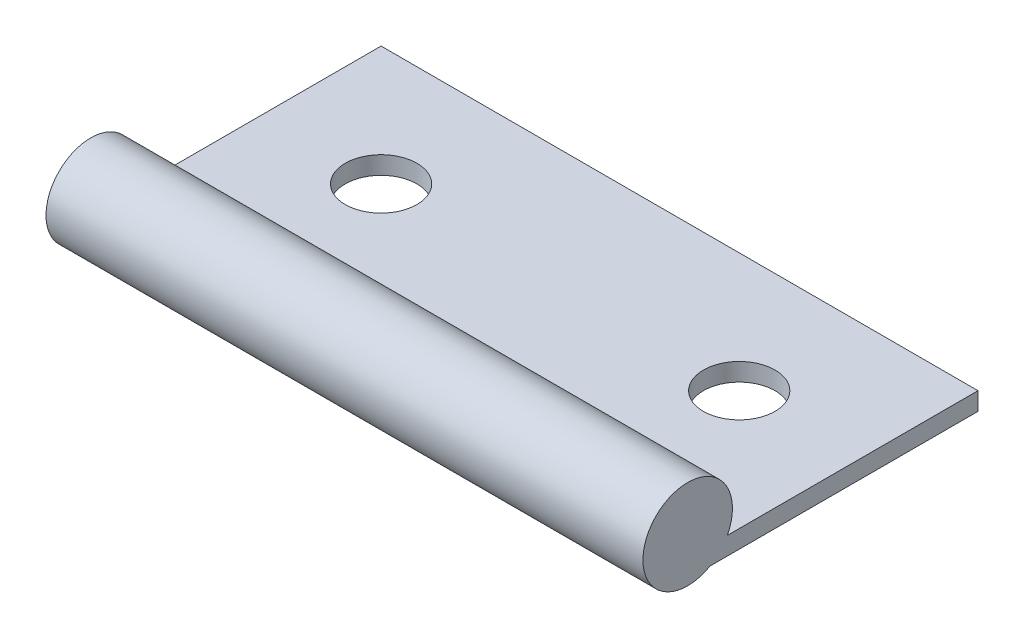
ISO-10303-21;
HEADER;
FILE_DESCRIPTION(('STEP AP214'),'2;1');
FILE_NAME('part.step','',(''),(''),'','','');
FILE_SCHEMA(('AUTOMOTIVE_DESIGN { 1 0 10303 214 1 1 1 1 }'));
ENDSEC;
DATA;
#1=APPLICATION_CONTEXT('core data for automotive mechanical design processes');
#2=APPLICATION_PROTOCOL_DEFINITION('international standard','automotive_design',2000,#1);
#3=PRODUCT_CONTEXT('',#1,'mechanical');
#4=PRODUCT('Part','Part','',(#3));
#5=PRODUCT_RELATED_PRODUCT_CATEGORY('part','',(#4));
#6=PRODUCT_DEFINITION_FORMATION('','',#4);
#7=PRODUCT_DEFINITION_CONTEXT('part definition',#1,'design');
#8=PRODUCT_DEFINITION('design','',#6,#7);
#9=PRODUCT_DEFINITION_SHAPE('','',#8);
#10=(LENGTH_UNIT() NAMED_UNIT(*) SI_UNIT(.MILLI.,.METRE.));
#11=(NAMED_UNIT(*) PLANE_ANGLE_UNIT() SI_UNIT($,.RADIAN.));
#12=(NAMED_UNIT(*) SI_UNIT($,.STERADIAN.) SOLID_ANGLE_UNIT());
#13=UNCERTAINTY_MEASURE_WITH_UNIT(LENGTH_MEASURE(1.E-05),#10,'distance_accuracy_value','');
#14=(GEOMETRIC_REPRESENTATION_CONTEXT(3) GLOBAL_UNCERTAINTY_ASSIGNED_CONTEXT((#13)) GLOBAL_UNIT_ASSIGNED_CONTEXT((#10,
#11,#12)) REPRESENTATION_CONTEXT('',''));
#15=CARTESIAN_POINT('',(0.,0.,0.));
#16=DIRECTION('',(0.,0.,1.));
#17=DIRECTION('',(1.,0.,0.));
#18=AXIS2_PLACEMENT_3D('',#15,#16,#17);
#19=CARTESIAN_POINT('',(50.,-3.25,-24.3166247903554));
#20=DIRECTION('',(0.,0.,1.));
#21=DIRECTION('',(1.,0.,0.));
#22=AXIS2_PLACEMENT_3D('',#19,#20,#21);
#23=PLANE('',#22);
#24=DIRECTION('',(0.,1.,0.));
#25=VECTOR('',#24,1.);
#26=CARTESIAN_POINT('',(0.,-3.25,-24.3166247903554));
#27=LINE('',#26,#25);
#28=CARTESIAN_POINT('',(0.,-3.25,-24.3166247903554));
#29=VERTEX_POINT('',#28);
#30=CARTESIAN_POINT('',(0.,-1.75,-24.3166247903554));
#31=VERTEX_POINT('',#30);
#32=EDGE_CURVE('E110',#29,#31,#27,.T.);
#33=ORIENTED_EDGE('',*,*,#32,.T.);
#34=DIRECTION('',(-1.,0.,0.));
#35=VECTOR('',#34,1.);
#36=CARTESIAN_POINT('',(50.,-1.75,-24.3166247903554));
#37=LINE('',#36,#35);
#38=CARTESIAN_POINT('',(50.,-1.75,-24.3166247903554));
#39=VERTEX_POINT('',#38);
#40=EDGE_CURVE('E11',#39,#31,#37,.T.);
#41=ORIENTED_EDGE('',*,*,#40,.F.);
#42=DIRECTION('',(0.,1.,0.));
#43=VECTOR('',#42,1.);
#44=CARTESIAN_POINT('',(50.,-3.25,-24.3166247903554));
#45=LINE('',#44,#43);
#46=CARTESIAN_POINT('',(50.,-3.25,-24.3166247903554));
#47=VERTEX_POINT('',#46);
#48=EDGE_CURVE('E93',#47,#39,#45,.T.);
#49=ORIENTED_EDGE('',*,*,#48,.F.);
#50=DIRECTION('',(-1.,0.,0.));
#51=VECTOR('',#50,1.);
#52=CARTESIAN_POINT('',(50.,-3.25,-24.3166247903554));
#53=LINE('',#52,#51);
#54=EDGE_CURVE('E106',#47,#29,#53,.T.);
#55=ORIENTED_EDGE('',*,*,#54,.T.);
#56=EDGE_LOOP('',(#33,#41,#49,#55));
#57=FACE_BOUND('',#56,.T.);
#58=ADVANCED_FACE('F39',(#57),#23,.F.);
#59=CARTESIAN_POINT('',(50.,-1.75,-3.3166247903554));
#60=DIRECTION('',(0.,-1.,0.));
#61=DIRECTION('',(0.,0.,-1.));
#62=AXIS2_PLACEMENT_3D('',#59,#60,#61);
#63=PLANE('',#62);
#64=CARTESIAN_POINT('',(10.,-1.75,-14.3166247903554));
#65=DIRECTION('',(0.,1.,0.));
#66=DIRECTION('',(0.,0.,1.));
#67=AXIS2_PLACEMENT_3D('',#64,#65,#66);
#68=CIRCLE('',#67,3.);
#69=CARTESIAN_POINT('',(10.,-1.75,-11.3166247903554));
#70=VERTEX_POINT('',#69);
#71=EDGE_CURVE('E126',#70,#70,#68,.T.);
#72=ORIENTED_EDGE('',*,*,#71,.F.);
#73=EDGE_LOOP('',(#72));
#74=FACE_BOUND('',#73,.T.);
#75=CARTESIAN_POINT('',(40.,-1.75,-14.3166247903554));
#76=DIRECTION('',(0.,1.,0.));
#77=DIRECTION('',(0.,0.,1.));
#78=AXIS2_PLACEMENT_3D('',#75,#76,#77);
#79=CIRCLE('',#78,3.);
#80=CARTESIAN_POINT('',(40.,-1.75,-11.3166247903554));
#81=VERTEX_POINT('',#80);
#82=EDGE_CURVE('E133',#81,#81,#79,.T.);
#83=ORIENTED_EDGE('',*,*,#82,.F.);
#84=EDGE_LOOP('',(#83));
#85=FACE_BOUND('',#84,.T.);
#86=DIRECTION('',(0.,0.,1.));
#87=VECTOR('',#86,1.);
#88=CARTESIAN_POINT('',(0.,-1.75,-3.3166247903554));
#89=LINE('',#88,#87);
#90=CARTESIAN_POINT('',(0.,-1.75,-3.3166247903554));
#91=VERTEX_POINT('',#90);
#92=EDGE_CURVE('E98',#31,#91,#89,.T.);
#93=ORIENTED_EDGE('',*,*,#92,.T.);
#94=DIRECTION('',(-1.,0.,0.));
#95=VECTOR('',#94,1.);
#96=CARTESIAN_POINT('',(50.,-1.75,-3.3166247903554));
#97=LINE('',#96,#95);
#98=CARTESIAN_POINT('',(50.,-1.75,-3.3166247903554));
#99=VERTEX_POINT('',#98);
#100=EDGE_CURVE('E49',#99,#91,#97,.T.);
#101=ORIENTED_EDGE('',*,*,#100,.F.);
#102=DIRECTION('',(0.,0.,1.));
#103=VECTOR('',#102,1.);
#104=CARTESIAN_POINT('',(50.,-1.75,-3.3166247903554));
#105=LINE('',#104,#103);
#106=EDGE_CURVE('E88',#39,#99,#105,.T.);
#107=ORIENTED_EDGE('',*,*,#106,.F.);
#108=ORIENTED_EDGE('',*,*,#40,.T.);
#109=EDGE_LOOP('',(#93,#101,#107,#108));
#110=FACE_BOUND('',#109,.T.);
#111=ADVANCED_FACE('F97',(#74,#85,#110),#63,.F.);
#112=CARTESIAN_POINT('',(50.,0.,0.));
#113=DIRECTION('',(-1.,0.,0.));
#114=DIRECTION('',(0.,0.,1.));
#115=AXIS2_PLACEMENT_3D('',#112,#113,#114);
#116=CYLINDRICAL_SURFACE('',#115,3.75);
#117=CARTESIAN_POINT('',(0.,0.,0.));
#118=DIRECTION('',(1.,0.,0.));
#119=DIRECTION('',(0.,0.,-1.));
#120=AXIS2_PLACEMENT_3D('',#117,#118,#119);
#121=CIRCLE('',#120,3.75);
#122=CARTESIAN_POINT('',(0.,-3.25,-1.87082869338697));
#123=VERTEX_POINT('',#122);
#124=EDGE_CURVE('E75',#91,#123,#121,.T.);
#125=ORIENTED_EDGE('',*,*,#124,.T.);
#126=DIRECTION('',(-1.,0.,0.));
#127=VECTOR('',#126,1.);
#128=CARTESIAN_POINT('',(50.,-3.25,-1.87082869338697));
#129=LINE('',#128,#127);
#130=CARTESIAN_POINT('',(50.,-3.25,-1.87082869338697));
#131=VERTEX_POINT('',#130);
#132=EDGE_CURVE('E100',#131,#123,#129,.T.);
#133=ORIENTED_EDGE('',*,*,#132,.F.);
#134=CARTESIAN_POINT('',(50.,0.,0.));
#135=DIRECTION('',(1.,0.,0.));
#136=DIRECTION('',(0.,0.,-1.));
#137=AXIS2_PLACEMENT_3D('',#134,#135,#136);
#138=CIRCLE('',#137,3.75);
#139=EDGE_CURVE('E91',#99,#131,#138,.T.);
#140=ORIENTED_EDGE('',*,*,#139,.F.);
#141=ORIENTED_EDGE('',*,*,#100,.T.);
#142=EDGE_LOOP('',(#125,#133,#140,#141));
#143=FACE_BOUND('',#142,.T.);
#144=ADVANCED_FACE('F102',(#143),#116,.T.);
#145=CARTESIAN_POINT('',(50.,-3.25,-1.87082869338697));
#146=DIRECTION('',(0.,1.,0.));
#147=DIRECTION('',(0.,0.,1.));
#148=AXIS2_PLACEMENT_3D('',#145,#146,#147);
#149=PLANE('',#148);
#150=CARTESIAN_POINT('',(10.,-3.25,-14.3166247903554));
#151=DIRECTION('',(0.,1.,0.));
#152=DIRECTION('',(0.,0.,1.));
#153=AXIS2_PLACEMENT_3D('',#150,#151,#152);
#154=CIRCLE('',#153,3.);
#155=CARTESIAN_POINT('',(10.,-3.25,-11.3166247903554));
#156=VERTEX_POINT('',#155);
#157=EDGE_CURVE('E42',#156,#156,#154,.T.);
#158=ORIENTED_EDGE('',*,*,#157,.T.);
#159=EDGE_LOOP('',(#158));
#160=FACE_BOUND('',#159,.T.);
#161=CARTESIAN_POINT('',(40.,-3.25,-14.3166247903554));
#162=DIRECTION('',(0.,1.,0.));
#163=DIRECTION('',(0.,0.,1.));
#164=AXIS2_PLACEMENT_3D('',#161,#162,#163);
#165=CIRCLE('',#164,3.);
#166=CARTESIAN_POINT('',(40.,-3.25,-11.3166247903554));
#167=VERTEX_POINT('',#166);
#168=EDGE_CURVE('E123',#167,#167,#165,.T.);
#169=ORIENTED_EDGE('',*,*,#168,.T.);
#170=EDGE_LOOP('',(#169));
#171=FACE_BOUND('',#170,.T.);
#172=DIRECTION('',(0.,0.,-1.));
#173=VECTOR('',#172,1.);
#174=CARTESIAN_POINT('',(0.,-3.25,-1.87082869338697));
#175=LINE('',#174,#173);
#176=EDGE_CURVE('E81',#123,#29,#175,.T.);
#177=ORIENTED_EDGE('',*,*,#176,.T.);
#178=ORIENTED_EDGE('',*,*,#54,.F.);
#179=DIRECTION('',(0.,0.,-1.));
#180=VECTOR('',#179,1.);
#181=CARTESIAN_POINT('',(50.,-3.25,-1.87082869338697));
#182=LINE('',#181,#180);
#183=EDGE_CURVE('E58',#131,#47,#182,.T.);
#184=ORIENTED_EDGE('',*,*,#183,.F.);
#185=ORIENTED_EDGE('',*,*,#132,.T.);
#186=EDGE_LOOP('',(#177,#178,#184,#185));
#187=FACE_BOUND('',#186,.T.);
#188=ADVANCED_FACE('F152',(#160,#171,#187),#149,.F.);
#189=CARTESIAN_POINT('',(50.,0.,0.));
#190=DIRECTION('',(1.,0.,0.));
#191=DIRECTION('',(0.,0.,-1.));
#192=AXIS2_PLACEMENT_3D('',#189,#190,#191);
#193=PLANE('',#192);
#194=ORIENTED_EDGE('',*,*,#48,.T.);
#195=ORIENTED_EDGE('',*,*,#106,.T.);
#196=ORIENTED_EDGE('',*,*,#139,.T.);
#197=ORIENTED_EDGE('',*,*,#183,.T.);
#198=EDGE_LOOP('',(#194,#195,#196,#197));
#199=FACE_BOUND('',#198,.T.);
#200=ADVANCED_FACE('F89',(#199),#193,.T.);
#201=CARTESIAN_POINT('',(0.,0.,0.));
#202=DIRECTION('',(1.,0.,0.));
#203=DIRECTION('',(0.,0.,-1.));
#204=AXIS2_PLACEMENT_3D('',#201,#202,#203);
#205=PLANE('',#204);
#206=ORIENTED_EDGE('',*,*,#32,.F.);
#207=ORIENTED_EDGE('',*,*,#176,.F.);
#208=ORIENTED_EDGE('',*,*,#124,.F.);
#209=ORIENTED_EDGE('',*,*,#92,.F.);
#210=EDGE_LOOP('',(#206,#207,#208,#209));
#211=FACE_BOUND('',#210,.T.);
#212=ADVANCED_FACE('F159',(#211),#205,.F.);
#213=CARTESIAN_POINT('',(40.,-51.75,-14.3166247903554));
#214=DIRECTION('',(0.,1.,0.));
#215=DIRECTION('',(0.,0.,1.));
#216=AXIS2_PLACEMENT_3D('',#213,#214,#215);
#217=CYLINDRICAL_SURFACE('',#216,3.);
#218=ORIENTED_EDGE('',*,*,#82,.T.);
#219=EDGE_LOOP('',(#218));
#220=FACE_BOUND('',#219,.T.);
#221=ORIENTED_EDGE('',*,*,#168,.F.);
#222=EDGE_LOOP('',(#221));
#223=FACE_BOUND('',#222,.T.);
#224=ADVANCED_FACE('F143',(#220,#223),#217,.F.);
#225=CARTESIAN_POINT('',(10.,-51.75,-14.3166247903554));
#226=DIRECTION('',(0.,1.,0.));
#227=DIRECTION('',(0.,0.,1.));
#228=AXIS2_PLACEMENT_3D('',#225,#226,#227);
#229=CYLINDRICAL_SURFACE('',#228,3.);
#230=ORIENTED_EDGE('',*,*,#71,.T.);
#231=EDGE_LOOP('',(#230));
#232=FACE_BOUND('',#231,.T.);
#233=ORIENTED_EDGE('',*,*,#157,.F.);
#234=EDGE_LOOP('',(#233));
#235=FACE_BOUND('',#234,.T.);
#236=ADVANCED_FACE('F167',(#232,#235),#229,.F.);
#237=CLOSED_SHELL('',(#58,#111,#144,#188,#200,#212,#224,#236));
#238=MANIFOLD_SOLID_BREP('B2',#237);
#239=ADVANCED_BREP_SHAPE_REPRESENTATION('',(#18,#238),#14);
#240=SHAPE_DEFINITION_REPRESENTATION(#9,#239);
ENDSEC;
END-ISO-10303-21;
